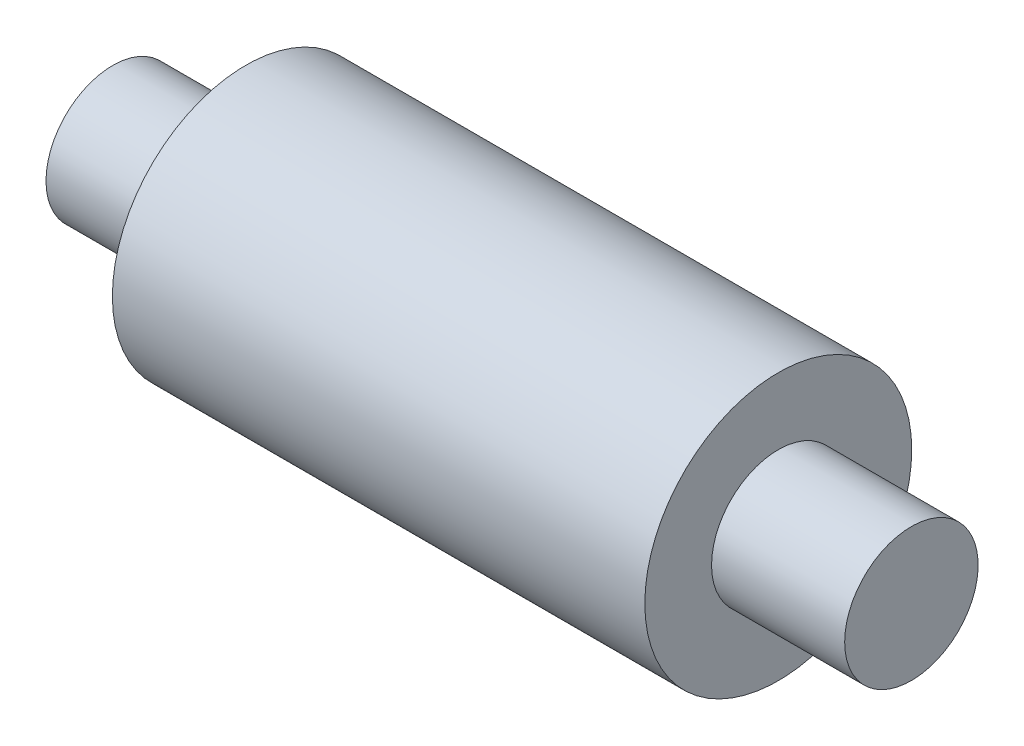
ISO-10303-21;
HEADER;
FILE_DESCRIPTION(('STEP AP214'),'2;1');
FILE_NAME('part.step','',(''),(''),'','','');
FILE_SCHEMA(('AUTOMOTIVE_DESIGN { 1 0 10303 214 1 1 1 1 }'));
ENDSEC;
DATA;
#1=APPLICATION_CONTEXT('core data for automotive mechanical design processes');
#2=APPLICATION_PROTOCOL_DEFINITION('international standard','automotive_design',2000,#1);
#3=PRODUCT_CONTEXT('',#1,'mechanical');
#4=PRODUCT('Part','Part','',(#3));
#5=PRODUCT_RELATED_PRODUCT_CATEGORY('part','',(#4));
#6=PRODUCT_DEFINITION_FORMATION('','',#4);
#7=PRODUCT_DEFINITION_CONTEXT('part definition',#1,'design');
#8=PRODUCT_DEFINITION('design','',#6,#7);
#9=PRODUCT_DEFINITION_SHAPE('','',#8);
#10=(LENGTH_UNIT() NAMED_UNIT(*) SI_UNIT(.MILLI.,.METRE.));
#11=(NAMED_UNIT(*) PLANE_ANGLE_UNIT() SI_UNIT($,.RADIAN.));
#12=(NAMED_UNIT(*) SI_UNIT($,.STERADIAN.) SOLID_ANGLE_UNIT());
#13=UNCERTAINTY_MEASURE_WITH_UNIT(LENGTH_MEASURE(1.E-05),#10,'distance_accuracy_value','');
#14=(GEOMETRIC_REPRESENTATION_CONTEXT(3) GLOBAL_UNCERTAINTY_ASSIGNED_CONTEXT((#13)) GLOBAL_UNIT_ASSIGNED_CONTEXT((#10,
#11,#12)) REPRESENTATION_CONTEXT('',''));
#15=CARTESIAN_POINT('',(0.,0.,0.));
#16=DIRECTION('',(0.,0.,1.));
#17=DIRECTION('',(1.,0.,0.));
#18=AXIS2_PLACEMENT_3D('',#15,#16,#17);
#19=CARTESIAN_POINT('',(57.15,0.,-4.7752));
#20=DIRECTION('',(1.,0.,0.));
#21=DIRECTION('',(0.,0.,-1.));
#22=AXIS2_PLACEMENT_3D('',#19,#20,#21);
#23=PLANE('',#22);
#24=CARTESIAN_POINT('',(57.15,0.,-4.7752));
#25=DIRECTION('',(-1.,0.,0.));
#26=DIRECTION('',(0.,0.,1.));
#27=AXIS2_PLACEMENT_3D('',#24,#25,#26);
#28=CIRCLE('',#27,4.7752);
#29=CARTESIAN_POINT('',(57.15,0.,0.));
#30=VERTEX_POINT('',#29);
#31=EDGE_CURVE('E10',#30,#30,#28,.T.);
#32=ORIENTED_EDGE('',*,*,#31,.F.);
#33=EDGE_LOOP('',(#32));
#34=FACE_BOUND('',#33,.T.);
#35=ADVANCED_FACE('F31',(#34),#23,.T.);
#36=CARTESIAN_POINT('',(0.,0.,-4.7752));
#37=DIRECTION('',(-1.,0.,0.));
#38=DIRECTION('',(0.,0.,1.));
#39=AXIS2_PLACEMENT_3D('',#36,#37,#38);
#40=CYLINDRICAL_SURFACE('',#39,4.7752);
#41=ORIENTED_EDGE('',*,*,#31,.T.);
#42=EDGE_LOOP('',(#41));
#43=FACE_BOUND('',#42,.T.);
#44=CARTESIAN_POINT('',(47.625,0.,-4.7752));
#45=DIRECTION('',(-1.,0.,0.));
#46=DIRECTION('',(0.,0.,1.));
#47=AXIS2_PLACEMENT_3D('',#44,#45,#46);
#48=CIRCLE('',#47,4.7752);
#49=CARTESIAN_POINT('',(47.625,0.,0.));
#50=VERTEX_POINT('',#49);
#51=EDGE_CURVE('E37',#50,#50,#48,.T.);
#52=ORIENTED_EDGE('',*,*,#51,.F.);
#53=EDGE_LOOP('',(#52));
#54=FACE_BOUND('',#53,.T.);
#55=ADVANCED_FACE('F73',(#43,#54),#40,.T.);
#56=CARTESIAN_POINT('',(47.625,0.,0.));
#57=DIRECTION('',(1.,0.,0.));
#58=DIRECTION('',(0.,0.,-1.));
#59=AXIS2_PLACEMENT_3D('',#56,#57,#58);
#60=PLANE('',#59);
#61=ORIENTED_EDGE('',*,*,#51,.T.);
#62=EDGE_LOOP('',(#61));
#63=FACE_BOUND('',#62,.T.);
#64=CARTESIAN_POINT('',(47.625,0.,-4.7752));
#65=DIRECTION('',(-1.,0.,0.));
#66=DIRECTION('',(0.,0.,1.));
#67=AXIS2_PLACEMENT_3D('',#64,#65,#66);
#68=CIRCLE('',#67,9.5504);
#69=CARTESIAN_POINT('',(47.625,0.,4.7752));
#70=VERTEX_POINT('',#69);
#71=EDGE_CURVE('E41',#70,#70,#68,.T.);
#72=ORIENTED_EDGE('',*,*,#71,.F.);
#73=EDGE_LOOP('',(#72));
#74=FACE_BOUND('',#73,.T.);
#75=ADVANCED_FACE('F78',(#63,#74),#60,.T.);
#76=CARTESIAN_POINT('',(0.,0.,-4.7752));
#77=DIRECTION('',(-1.,0.,0.));
#78=DIRECTION('',(0.,0.,1.));
#79=AXIS2_PLACEMENT_3D('',#76,#77,#78);
#80=CYLINDRICAL_SURFACE('',#79,9.5504);
#81=ORIENTED_EDGE('',*,*,#71,.T.);
#82=EDGE_LOOP('',(#81));
#83=FACE_BOUND('',#82,.T.);
#84=CARTESIAN_POINT('',(9.525,0.,-4.7752));
#85=DIRECTION('',(-1.,0.,0.));
#86=DIRECTION('',(0.,0.,1.));
#87=AXIS2_PLACEMENT_3D('',#84,#85,#86);
#88=CIRCLE('',#87,9.5504);
#89=CARTESIAN_POINT('',(9.525,0.,4.7752));
#90=VERTEX_POINT('',#89);
#91=EDGE_CURVE('E45',#90,#90,#88,.T.);
#92=ORIENTED_EDGE('',*,*,#91,.F.);
#93=EDGE_LOOP('',(#92));
#94=FACE_BOUND('',#93,.T.);
#95=ADVANCED_FACE('F69',(#83,#94),#80,.T.);
#96=CARTESIAN_POINT('',(9.525,0.,0.));
#97=DIRECTION('',(-1.,0.,0.));
#98=DIRECTION('',(0.,0.,1.));
#99=AXIS2_PLACEMENT_3D('',#96,#97,#98);
#100=PLANE('',#99);
#101=ORIENTED_EDGE('',*,*,#91,.T.);
#102=EDGE_LOOP('',(#101));
#103=FACE_BOUND('',#102,.T.);
#104=CARTESIAN_POINT('',(9.525,0.,-4.7752));
#105=DIRECTION('',(-1.,0.,0.));
#106=DIRECTION('',(0.,0.,1.));
#107=AXIS2_PLACEMENT_3D('',#104,#105,#106);
#108=CIRCLE('',#107,4.7752);
#109=CARTESIAN_POINT('',(9.525,0.,0.));
#110=VERTEX_POINT('',#109);
#111=EDGE_CURVE('E50',#110,#110,#108,.T.);
#112=ORIENTED_EDGE('',*,*,#111,.F.);
#113=EDGE_LOOP('',(#112));
#114=FACE_BOUND('',#113,.T.);
#115=ADVANCED_FACE('F61',(#103,#114),#100,.T.);
#116=CARTESIAN_POINT('',(0.,0.,-4.7752));
#117=DIRECTION('',(-1.,0.,0.));
#118=DIRECTION('',(0.,0.,1.));
#119=AXIS2_PLACEMENT_3D('',#116,#117,#118);
#120=CYLINDRICAL_SURFACE('',#119,4.7752);
#121=ORIENTED_EDGE('',*,*,#111,.T.);
#122=EDGE_LOOP('',(#121));
#123=FACE_BOUND('',#122,.T.);
#124=CARTESIAN_POINT('',(0.,0.,-4.7752));
#125=DIRECTION('',(-1.,0.,0.));
#126=DIRECTION('',(0.,0.,1.));
#127=AXIS2_PLACEMENT_3D('',#124,#125,#126);
#128=CIRCLE('',#127,4.7752);
#129=CARTESIAN_POINT('',(0.,0.,0.));
#130=VERTEX_POINT('',#129);
#131=EDGE_CURVE('E53',#130,#130,#128,.T.);
#132=ORIENTED_EDGE('',*,*,#131,.F.);
#133=EDGE_LOOP('',(#132));
#134=FACE_BOUND('',#133,.T.);
#135=ADVANCED_FACE('F59',(#123,#134),#120,.T.);
#136=CARTESIAN_POINT('',(0.,0.,-4.7752));
#137=DIRECTION('',(-1.,0.,0.));
#138=DIRECTION('',(0.,0.,1.));
#139=AXIS2_PLACEMENT_3D('',#136,#137,#138);
#140=PLANE('',#139);
#141=ORIENTED_EDGE('',*,*,#131,.T.);
#142=EDGE_LOOP('',(#141));
#143=FACE_BOUND('',#142,.T.);
#144=ADVANCED_FACE('F57',(#143),#140,.T.);
#145=CLOSED_SHELL('',(#35,#55,#75,#95,#115,#135,#144));
#146=MANIFOLD_SOLID_BREP('B2',#145);
#147=ADVANCED_BREP_SHAPE_REPRESENTATION('',(#18,#146),#14);
#148=SHAPE_DEFINITION_REPRESENTATION(#9,#147);
ENDSEC;
END-ISO-10303-21;
